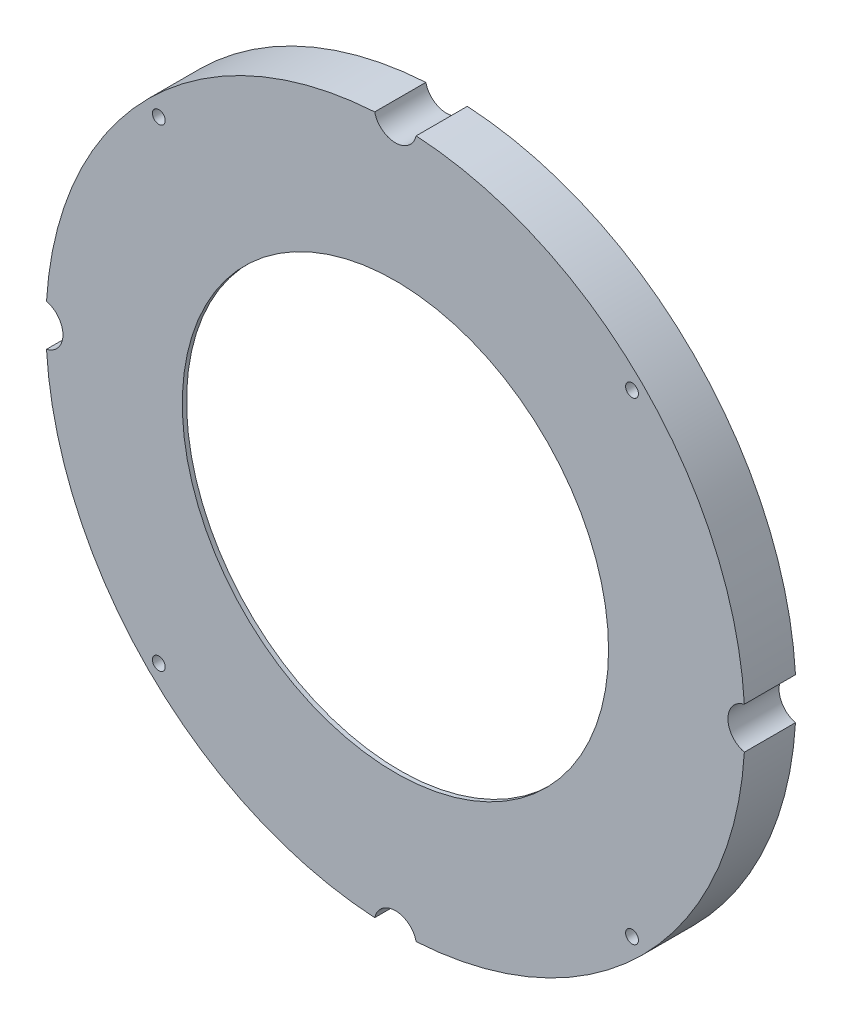
ISO-10303-21;
HEADER;
FILE_DESCRIPTION(('STEP AP214'),'2;1');
FILE_NAME('part.step','',(''),(''),'','','');
FILE_SCHEMA(('AUTOMOTIVE_DESIGN { 1 0 10303 214 1 1 1 1 }'));
ENDSEC;
DATA;
#1=APPLICATION_CONTEXT('core data for automotive mechanical design processes');
#2=APPLICATION_PROTOCOL_DEFINITION('international standard','automotive_design',2000,#1);
#3=PRODUCT_CONTEXT('',#1,'mechanical');
#4=PRODUCT('Part','Part','',(#3));
#5=PRODUCT_RELATED_PRODUCT_CATEGORY('part','',(#4));
#6=PRODUCT_DEFINITION_FORMATION('','',#4);
#7=PRODUCT_DEFINITION_CONTEXT('part definition',#1,'design');
#8=PRODUCT_DEFINITION('design','',#6,#7);
#9=PRODUCT_DEFINITION_SHAPE('','',#8);
#10=(LENGTH_UNIT() NAMED_UNIT(*) SI_UNIT(.MILLI.,.METRE.));
#11=(NAMED_UNIT(*) PLANE_ANGLE_UNIT() SI_UNIT($,.RADIAN.));
#12=(NAMED_UNIT(*) SI_UNIT($,.STERADIAN.) SOLID_ANGLE_UNIT());
#13=UNCERTAINTY_MEASURE_WITH_UNIT(LENGTH_MEASURE(1.E-05),#10,'distance_accuracy_value','');
#14=(GEOMETRIC_REPRESENTATION_CONTEXT(3) GLOBAL_UNCERTAINTY_ASSIGNED_CONTEXT((#13)) GLOBAL_UNIT_ASSIGNED_CONTEXT((#10,
#11,#12)) REPRESENTATION_CONTEXT('',''));
#15=CARTESIAN_POINT('',(0.,0.,0.));
#16=DIRECTION('',(0.,0.,1.));
#17=DIRECTION('',(1.,0.,0.));
#18=AXIS2_PLACEMENT_3D('',#15,#16,#17);
#19=CARTESIAN_POINT('',(0.,0.,1.));
#20=DIRECTION('',(0.,0.,-1.));
#21=DIRECTION('',(-1.,0.,0.));
#22=AXIS2_PLACEMENT_3D('',#19,#20,#21);
#23=CYLINDRICAL_SURFACE('',#22,82.);
#24=CARTESIAN_POINT('',(0.,0.,-11.));
#25=DIRECTION('',(0.,0.,-1.));
#26=DIRECTION('',(-1.,0.,0.));
#27=AXIS2_PLACEMENT_3D('',#24,#25,#26);
#28=CIRCLE('',#27,82.);
#29=CARTESIAN_POINT('',(-81.8554216867469,4.86723129559705,-11.));
#30=VERTEX_POINT('',#29);
#31=CARTESIAN_POINT('',(-4.86723129559619,81.855421686747,-11.));
#32=VERTEX_POINT('',#31);
#33=EDGE_CURVE('E117',#30,#32,#28,.T.);
#34=ORIENTED_EDGE('',*,*,#33,.F.);
#35=DIRECTION('',(0.,0.,1.));
#36=VECTOR('',#35,1.);
#37=CARTESIAN_POINT('',(-81.8554216867469,4.86723129559704,-5.));
#38=LINE('',#37,#36);
#39=CARTESIAN_POINT('',(-81.8554216867469,4.86723129559704,1.));
#40=VERTEX_POINT('',#39);
#41=EDGE_CURVE('E48',#30,#40,#38,.T.);
#42=ORIENTED_EDGE('',*,*,#41,.T.);
#43=CARTESIAN_POINT('',(0.,0.,1.));
#44=DIRECTION('',(0.,0.,1.));
#45=DIRECTION('',(1.,0.,0.));
#46=AXIS2_PLACEMENT_3D('',#43,#44,#45);
#47=CIRCLE('',#46,82.);
#48=CARTESIAN_POINT('',(-4.86723129559619,81.855421686747,1.));
#49=VERTEX_POINT('',#48);
#50=EDGE_CURVE('E11',#49,#40,#47,.T.);
#51=ORIENTED_EDGE('',*,*,#50,.F.);
#52=DIRECTION('',(0.,0.,1.));
#53=VECTOR('',#52,1.);
#54=CARTESIAN_POINT('',(-4.86723129559619,81.855421686747,-5.));
#55=LINE('',#54,#53);
#56=EDGE_CURVE('E156',#49,#32,#55,.F.);
#57=ORIENTED_EDGE('',*,*,#56,.T.);
#58=EDGE_LOOP('',(#34,#42,#51,#57));
#59=FACE_BOUND('',#58,.T.);
#60=ADVANCED_FACE('F32',(#59),#23,.T.);
#61=CARTESIAN_POINT('',(-81.8554216867471,-4.86723129559533,1.));
#62=VERTEX_POINT('',#61);
#63=CARTESIAN_POINT('',(-4.86723129559619,-81.855421686747,1.));
#64=VERTEX_POINT('',#63);
#65=EDGE_CURVE('E40',#62,#64,#47,.T.);
#66=ORIENTED_EDGE('',*,*,#65,.F.);
#67=DIRECTION('',(0.,0.,1.));
#68=VECTOR('',#67,1.);
#69=CARTESIAN_POINT('',(-81.8554216867471,-4.86723129559533,-5.));
#70=LINE('',#69,#68);
#71=CARTESIAN_POINT('',(-81.8554216867471,-4.86723129559533,-11.));
#72=VERTEX_POINT('',#71);
#73=EDGE_CURVE('E99',#62,#72,#70,.F.);
#74=ORIENTED_EDGE('',*,*,#73,.T.);
#75=CARTESIAN_POINT('',(-4.86723129559619,-81.855421686747,-11.));
#76=VERTEX_POINT('',#75);
#77=EDGE_CURVE('E110',#76,#72,#28,.T.);
#78=ORIENTED_EDGE('',*,*,#77,.F.);
#79=DIRECTION('',(0.,0.,1.));
#80=VECTOR('',#79,1.);
#81=CARTESIAN_POINT('',(-4.86723129559619,-81.855421686747,-5.));
#82=LINE('',#81,#80);
#83=EDGE_CURVE('E56',#76,#64,#82,.T.);
#84=ORIENTED_EDGE('',*,*,#83,.T.);
#85=EDGE_LOOP('',(#66,#74,#78,#84));
#86=FACE_BOUND('',#85,.T.);
#87=ADVANCED_FACE('F109',(#86),#23,.T.);
#88=CARTESIAN_POINT('',(4.86723129559619,-81.855421686747,1.));
#89=VERTEX_POINT('',#88);
#90=CARTESIAN_POINT('',(81.855421686747,-4.86723129559647,1.));
#91=VERTEX_POINT('',#90);
#92=EDGE_CURVE('E264',#89,#91,#47,.T.);
#93=ORIENTED_EDGE('',*,*,#92,.F.);
#94=DIRECTION('',(0.,0.,1.));
#95=VECTOR('',#94,1.);
#96=CARTESIAN_POINT('',(4.86723129559619,-81.855421686747,-5.));
#97=LINE('',#96,#95);
#98=CARTESIAN_POINT('',(4.86723129559619,-81.855421686747,-11.));
#99=VERTEX_POINT('',#98);
#100=EDGE_CURVE('E247',#89,#99,#97,.F.);
#101=ORIENTED_EDGE('',*,*,#100,.T.);
#102=CARTESIAN_POINT('',(81.855421686747,-4.86723129559648,-11.));
#103=VERTEX_POINT('',#102);
#104=EDGE_CURVE('E116',#103,#99,#28,.T.);
#105=ORIENTED_EDGE('',*,*,#104,.F.);
#106=DIRECTION('',(0.,0.,1.));
#107=VECTOR('',#106,1.);
#108=CARTESIAN_POINT('',(81.855421686747,-4.86723129559647,-5.));
#109=LINE('',#108,#107);
#110=EDGE_CURVE('E170',#103,#91,#109,.T.);
#111=ORIENTED_EDGE('',*,*,#110,.T.);
#112=EDGE_LOOP('',(#93,#101,#105,#111));
#113=FACE_BOUND('',#112,.T.);
#114=ADVANCED_FACE('F147',(#113),#23,.T.);
#115=CARTESIAN_POINT('',(0.,0.,1.));
#116=DIRECTION('',(0.,0.,1.));
#117=DIRECTION('',(1.,0.,0.));
#118=AXIS2_PLACEMENT_3D('',#115,#116,#117);
#119=PLANE('',#118);
#120=CARTESIAN_POINT('',(-55.5078823231446,-55.5078823231434,1.));
#121=DIRECTION('',(0.,0.,-1.));
#122=DIRECTION('',(0.,-1.,0.));
#123=AXIS2_PLACEMENT_3D('',#120,#121,#122);
#124=CIRCLE('',#123,1.5);
#125=CARTESIAN_POINT('',(-55.5078823231446,-57.0078823231434,1.));
#126=VERTEX_POINT('',#125);
#127=EDGE_CURVE('E218',#126,#126,#124,.T.);
#128=ORIENTED_EDGE('',*,*,#127,.T.);
#129=EDGE_LOOP('',(#128));
#130=FACE_BOUND('',#129,.T.);
#131=CARTESIAN_POINT('',(55.507882323144,-55.507882323144,1.));
#132=DIRECTION('',(0.,0.,-1.));
#133=DIRECTION('',(1.,0.,0.));
#134=AXIS2_PLACEMENT_3D('',#131,#132,#133);
#135=CIRCLE('',#134,1.5);
#136=CARTESIAN_POINT('',(57.007882323144,-55.507882323144,1.));
#137=VERTEX_POINT('',#136);
#138=EDGE_CURVE('E226',#137,#137,#135,.T.);
#139=ORIENTED_EDGE('',*,*,#138,.T.);
#140=EDGE_LOOP('',(#139));
#141=FACE_BOUND('',#140,.T.);
#142=CARTESIAN_POINT('',(55.5078823231442,55.5078823231438,1.));
#143=DIRECTION('',(0.,0.,-1.));
#144=DIRECTION('',(0.,1.,0.));
#145=AXIS2_PLACEMENT_3D('',#142,#143,#144);
#146=CIRCLE('',#145,1.5);
#147=CARTESIAN_POINT('',(55.5078823231442,57.0078823231438,1.));
#148=VERTEX_POINT('',#147);
#149=EDGE_CURVE('E232',#148,#148,#146,.T.);
#150=ORIENTED_EDGE('',*,*,#149,.T.);
#151=EDGE_LOOP('',(#150));
#152=FACE_BOUND('',#151,.T.);
#153=CARTESIAN_POINT('',(-55.507882323144,55.507882323144,1.));
#154=DIRECTION('',(0.,0.,-1.));
#155=DIRECTION('',(-1.,0.,0.));
#156=AXIS2_PLACEMENT_3D('',#153,#154,#155);
#157=CIRCLE('',#156,1.5);
#158=CARTESIAN_POINT('',(-57.007882323144,55.507882323144,1.));
#159=VERTEX_POINT('',#158);
#160=EDGE_CURVE('E238',#159,#159,#157,.T.);
#161=ORIENTED_EDGE('',*,*,#160,.T.);
#162=EDGE_LOOP('',(#161));
#163=FACE_BOUND('',#162,.T.);
#164=CARTESIAN_POINT('',(-83.,8.6937885337194E-13,1.));
#165=DIRECTION('',(0.,0.,1.));
#166=DIRECTION('',(0.,1.,0.));
#167=AXIS2_PLACEMENT_3D('',#164,#165,#166);
#168=CIRCLE('',#167,5.);
#169=EDGE_CURVE('E104',#62,#40,#168,.T.);
#170=ORIENTED_EDGE('',*,*,#169,.F.);
#171=ORIENTED_EDGE('',*,*,#65,.T.);
#172=CARTESIAN_POINT('',(0.,-83.,1.));
#173=DIRECTION('',(0.,0.,1.));
#174=DIRECTION('',(-1.,0.,0.));
#175=AXIS2_PLACEMENT_3D('',#172,#173,#174);
#176=CIRCLE('',#175,5.);
#177=EDGE_CURVE('E245',#89,#64,#176,.T.);
#178=ORIENTED_EDGE('',*,*,#177,.F.);
#179=ORIENTED_EDGE('',*,*,#92,.T.);
#180=CARTESIAN_POINT('',(83.,-2.8979295112398E-13,1.));
#181=DIRECTION('',(0.,0.,1.));
#182=DIRECTION('',(0.,-1.,0.));
#183=AXIS2_PLACEMENT_3D('',#180,#181,#182);
#184=CIRCLE('',#183,5.);
#185=CARTESIAN_POINT('',(81.855421686747,4.8672312955959,1.));
#186=VERTEX_POINT('',#185);
#187=EDGE_CURVE('E252',#186,#91,#184,.T.);
#188=ORIENTED_EDGE('',*,*,#187,.F.);
#189=CARTESIAN_POINT('',(4.86723129559619,81.855421686747,1.));
#190=VERTEX_POINT('',#189);
#191=EDGE_CURVE('E41',#186,#190,#47,.T.);
#192=ORIENTED_EDGE('',*,*,#191,.T.);
#193=CARTESIAN_POINT('',(0.,83.,1.));
#194=DIRECTION('',(0.,0.,1.));
#195=DIRECTION('',(1.,0.,0.));
#196=AXIS2_PLACEMENT_3D('',#193,#194,#195);
#197=CIRCLE('',#196,5.);
#198=EDGE_CURVE('E167',#49,#190,#197,.T.);
#199=ORIENTED_EDGE('',*,*,#198,.F.);
#200=ORIENTED_EDGE('',*,*,#50,.T.);
#201=EDGE_LOOP('',(#170,#171,#178,#179,#188,#192,#199,#200));
#202=FACE_BOUND('',#201,.T.);
#203=CARTESIAN_POINT('',(0.,0.,1.));
#204=DIRECTION('',(0.,0.,1.));
#205=DIRECTION('',(1.,0.,0.));
#206=AXIS2_PLACEMENT_3D('',#203,#204,#205);
#207=CIRCLE('',#206,50.);
#208=CARTESIAN_POINT('',(50.,0.,1.));
#209=VERTEX_POINT('',#208);
#210=EDGE_CURVE('E127',#209,#209,#207,.T.);
#211=ORIENTED_EDGE('',*,*,#210,.F.);
#212=EDGE_LOOP('',(#211));
#213=FACE_BOUND('',#212,.T.);
#214=ADVANCED_FACE('F268',(#130,#141,#152,#163,#202,#213),#119,.T.);
#215=CARTESIAN_POINT('',(0.,0.,0.));
#216=DIRECTION('',(0.,0.,1.));
#217=DIRECTION('',(1.,0.,0.));
#218=AXIS2_PLACEMENT_3D('',#215,#216,#217);
#219=PLANE('',#218);
#220=CARTESIAN_POINT('',(0.,0.,0.));
#221=DIRECTION('',(0.,0.,-1.));
#222=DIRECTION('',(-1.,0.,0.));
#223=AXIS2_PLACEMENT_3D('',#220,#221,#222);
#224=CIRCLE('',#223,75.);
#225=CARTESIAN_POINT('',(-75.,0.,0.));
#226=VERTEX_POINT('',#225);
#227=EDGE_CURVE('E125',#226,#226,#224,.T.);
#228=ORIENTED_EDGE('',*,*,#227,.T.);
#229=EDGE_LOOP('',(#228));
#230=FACE_BOUND('',#229,.T.);
#231=CARTESIAN_POINT('',(0.,0.,0.));
#232=DIRECTION('',(0.,0.,1.));
#233=DIRECTION('',(1.,0.,0.));
#234=AXIS2_PLACEMENT_3D('',#231,#232,#233);
#235=CIRCLE('',#234,50.);
#236=CARTESIAN_POINT('',(50.,0.,0.));
#237=VERTEX_POINT('',#236);
#238=EDGE_CURVE('E124',#237,#237,#235,.T.);
#239=ORIENTED_EDGE('',*,*,#238,.T.);
#240=EDGE_LOOP('',(#239));
#241=FACE_BOUND('',#240,.T.);
#242=ADVANCED_FACE('F132',(#230,#241),#219,.F.);
#243=ORIENTED_EDGE('',*,*,#191,.F.);
#244=DIRECTION('',(0.,0.,1.));
#245=VECTOR('',#244,1.);
#246=CARTESIAN_POINT('',(81.855421686747,4.8672312955959,-5.));
#247=LINE('',#246,#245);
#248=CARTESIAN_POINT('',(81.855421686747,4.8672312955959,-11.));
#249=VERTEX_POINT('',#248);
#250=EDGE_CURVE('E256',#186,#249,#247,.F.);
#251=ORIENTED_EDGE('',*,*,#250,.T.);
#252=CARTESIAN_POINT('',(4.86723129559619,81.855421686747,-11.));
#253=VERTEX_POINT('',#252);
#254=EDGE_CURVE('E119',#253,#249,#28,.T.);
#255=ORIENTED_EDGE('',*,*,#254,.F.);
#256=DIRECTION('',(0.,0.,1.));
#257=VECTOR('',#256,1.);
#258=CARTESIAN_POINT('',(4.86723129559619,81.855421686747,-5.));
#259=LINE('',#258,#257);
#260=EDGE_CURVE('E166',#253,#190,#259,.T.);
#261=ORIENTED_EDGE('',*,*,#260,.T.);
#262=EDGE_LOOP('',(#243,#251,#255,#261));
#263=FACE_BOUND('',#262,.T.);
#264=ADVANCED_FACE('F34',(#263),#23,.T.);
#265=CARTESIAN_POINT('',(0.,0.,1.));
#266=DIRECTION('',(0.,0.,-1.));
#267=DIRECTION('',(-1.,0.,0.));
#268=AXIS2_PLACEMENT_3D('',#265,#266,#267);
#269=CYLINDRICAL_SURFACE('',#268,50.);
#270=ORIENTED_EDGE('',*,*,#210,.T.);
#271=EDGE_LOOP('',(#270));
#272=FACE_BOUND('',#271,.T.);
#273=ORIENTED_EDGE('',*,*,#238,.F.);
#274=EDGE_LOOP('',(#273));
#275=FACE_BOUND('',#274,.T.);
#276=ADVANCED_FACE('F134',(#272,#275),#269,.F.);
#277=CARTESIAN_POINT('',(0.,0.,-11.));
#278=DIRECTION('',(0.,0.,-1.));
#279=DIRECTION('',(-1.,0.,0.));
#280=AXIS2_PLACEMENT_3D('',#277,#278,#279);
#281=PLANE('',#280);
#282=CARTESIAN_POINT('',(-55.5078823231446,-55.5078823231434,-11.));
#283=DIRECTION('',(0.,0.,-1.));
#284=DIRECTION('',(0.,-1.,0.));
#285=AXIS2_PLACEMENT_3D('',#282,#283,#284);
#286=CIRCLE('',#285,1.5);
#287=CARTESIAN_POINT('',(-55.5078823231446,-57.0078823231434,-11.));
#288=VERTEX_POINT('',#287);
#289=EDGE_CURVE('E221',#288,#288,#286,.T.);
#290=ORIENTED_EDGE('',*,*,#289,.F.);
#291=EDGE_LOOP('',(#290));
#292=FACE_BOUND('',#291,.T.);
#293=CARTESIAN_POINT('',(55.507882323144,-55.507882323144,-11.));
#294=DIRECTION('',(0.,0.,-1.));
#295=DIRECTION('',(1.,0.,0.));
#296=AXIS2_PLACEMENT_3D('',#293,#294,#295);
#297=CIRCLE('',#296,1.5);
#298=CARTESIAN_POINT('',(57.007882323144,-55.507882323144,-11.));
#299=VERTEX_POINT('',#298);
#300=EDGE_CURVE('E223',#299,#299,#297,.T.);
#301=ORIENTED_EDGE('',*,*,#300,.F.);
#302=EDGE_LOOP('',(#301));
#303=FACE_BOUND('',#302,.T.);
#304=CARTESIAN_POINT('',(55.5078823231442,55.5078823231438,-11.));
#305=DIRECTION('',(0.,0.,-1.));
#306=DIRECTION('',(0.,1.,0.));
#307=AXIS2_PLACEMENT_3D('',#304,#305,#306);
#308=CIRCLE('',#307,1.5);
#309=CARTESIAN_POINT('',(55.5078823231442,57.0078823231438,-11.));
#310=VERTEX_POINT('',#309);
#311=EDGE_CURVE('E229',#310,#310,#308,.T.);
#312=ORIENTED_EDGE('',*,*,#311,.F.);
#313=EDGE_LOOP('',(#312));
#314=FACE_BOUND('',#313,.T.);
#315=CARTESIAN_POINT('',(-55.507882323144,55.507882323144,-11.));
#316=DIRECTION('',(0.,0.,-1.));
#317=DIRECTION('',(-1.,0.,0.));
#318=AXIS2_PLACEMENT_3D('',#315,#316,#317);
#319=CIRCLE('',#318,1.5);
#320=CARTESIAN_POINT('',(-57.007882323144,55.507882323144,-11.));
#321=VERTEX_POINT('',#320);
#322=EDGE_CURVE('E235',#321,#321,#319,.T.);
#323=ORIENTED_EDGE('',*,*,#322,.F.);
#324=EDGE_LOOP('',(#323));
#325=FACE_BOUND('',#324,.T.);
#326=CARTESIAN_POINT('',(-83.,8.6937885337194E-13,-11.));
#327=DIRECTION('',(0.,0.,1.));
#328=DIRECTION('',(0.,1.,0.));
#329=AXIS2_PLACEMENT_3D('',#326,#327,#328);
#330=CIRCLE('',#329,5.);
#331=EDGE_CURVE('E96',#72,#30,#330,.T.);
#332=ORIENTED_EDGE('',*,*,#331,.T.);
#333=ORIENTED_EDGE('',*,*,#33,.T.);
#334=CARTESIAN_POINT('',(0.,83.,-11.));
#335=DIRECTION('',(0.,0.,1.));
#336=DIRECTION('',(1.,0.,0.));
#337=AXIS2_PLACEMENT_3D('',#334,#335,#336);
#338=CIRCLE('',#337,5.);
#339=EDGE_CURVE('E159',#32,#253,#338,.T.);
#340=ORIENTED_EDGE('',*,*,#339,.T.);
#341=ORIENTED_EDGE('',*,*,#254,.T.);
#342=CARTESIAN_POINT('',(83.,-2.8979295112398E-13,-11.));
#343=DIRECTION('',(0.,0.,1.));
#344=DIRECTION('',(0.,-1.,0.));
#345=AXIS2_PLACEMENT_3D('',#342,#343,#344);
#346=CIRCLE('',#345,5.);
#347=EDGE_CURVE('E253',#249,#103,#346,.T.);
#348=ORIENTED_EDGE('',*,*,#347,.T.);
#349=ORIENTED_EDGE('',*,*,#104,.T.);
#350=CARTESIAN_POINT('',(0.,-83.,-11.));
#351=DIRECTION('',(0.,0.,1.));
#352=DIRECTION('',(-1.,0.,0.));
#353=AXIS2_PLACEMENT_3D('',#350,#351,#352);
#354=CIRCLE('',#353,5.);
#355=EDGE_CURVE('E115',#99,#76,#354,.T.);
#356=ORIENTED_EDGE('',*,*,#355,.T.);
#357=ORIENTED_EDGE('',*,*,#77,.T.);
#358=EDGE_LOOP('',(#332,#333,#340,#341,#348,#349,#356,#357));
#359=FACE_BOUND('',#358,.T.);
#360=CARTESIAN_POINT('',(0.,0.,-11.));
#361=DIRECTION('',(0.,0.,-1.));
#362=DIRECTION('',(-1.,0.,0.));
#363=AXIS2_PLACEMENT_3D('',#360,#361,#362);
#364=CIRCLE('',#363,75.);
#365=CARTESIAN_POINT('',(-75.,0.,-11.));
#366=VERTEX_POINT('',#365);
#367=EDGE_CURVE('E120',#366,#366,#364,.T.);
#368=ORIENTED_EDGE('',*,*,#367,.F.);
#369=EDGE_LOOP('',(#368));
#370=FACE_BOUND('',#369,.T.);
#371=ADVANCED_FACE('F112',(#292,#303,#314,#325,#359,#370),#281,.T.);
#372=CARTESIAN_POINT('',(0.,0.,-11.));
#373=DIRECTION('',(0.,0.,1.));
#374=DIRECTION('',(1.,0.,0.));
#375=AXIS2_PLACEMENT_3D('',#372,#373,#374);
#376=CYLINDRICAL_SURFACE('',#375,75.);
#377=ORIENTED_EDGE('',*,*,#367,.T.);
#378=EDGE_LOOP('',(#377));
#379=FACE_BOUND('',#378,.T.);
#380=ORIENTED_EDGE('',*,*,#227,.F.);
#381=EDGE_LOOP('',(#380));
#382=FACE_BOUND('',#381,.T.);
#383=ADVANCED_FACE('F143',(#379,#382),#376,.F.);
#384=CARTESIAN_POINT('',(0.,83.,-11.));
#385=DIRECTION('',(0.,0.,1.));
#386=DIRECTION('',(1.,0.,0.));
#387=AXIS2_PLACEMENT_3D('',#384,#385,#386);
#388=CYLINDRICAL_SURFACE('',#387,5.);
#389=ORIENTED_EDGE('',*,*,#339,.F.);
#390=ORIENTED_EDGE('',*,*,#56,.F.);
#391=ORIENTED_EDGE('',*,*,#198,.T.);
#392=ORIENTED_EDGE('',*,*,#260,.F.);
#393=EDGE_LOOP('',(#389,#390,#391,#392));
#394=FACE_BOUND('',#393,.T.);
#395=ADVANCED_FACE('F162',(#394),#388,.F.);
#396=CARTESIAN_POINT('',(83.,-2.8979295112398E-13,-11.));
#397=DIRECTION('',(0.,0.,1.));
#398=DIRECTION('',(1.,0.,0.));
#399=AXIS2_PLACEMENT_3D('',#396,#397,#398);
#400=CYLINDRICAL_SURFACE('',#399,5.);
#401=ORIENTED_EDGE('',*,*,#347,.F.);
#402=ORIENTED_EDGE('',*,*,#250,.F.);
#403=ORIENTED_EDGE('',*,*,#187,.T.);
#404=ORIENTED_EDGE('',*,*,#110,.F.);
#405=EDGE_LOOP('',(#401,#402,#403,#404));
#406=FACE_BOUND('',#405,.T.);
#407=ADVANCED_FACE('F187',(#406),#400,.F.);
#408=CARTESIAN_POINT('',(0.,-83.,-11.));
#409=DIRECTION('',(0.,0.,1.));
#410=DIRECTION('',(1.,0.,0.));
#411=AXIS2_PLACEMENT_3D('',#408,#409,#410);
#412=CYLINDRICAL_SURFACE('',#411,5.);
#413=ORIENTED_EDGE('',*,*,#355,.F.);
#414=ORIENTED_EDGE('',*,*,#100,.F.);
#415=ORIENTED_EDGE('',*,*,#177,.T.);
#416=ORIENTED_EDGE('',*,*,#83,.F.);
#417=EDGE_LOOP('',(#413,#414,#415,#416));
#418=FACE_BOUND('',#417,.T.);
#419=ADVANCED_FACE('F192',(#418),#412,.F.);
#420=CARTESIAN_POINT('',(-83.,8.6937885337194E-13,-11.));
#421=DIRECTION('',(0.,0.,1.));
#422=DIRECTION('',(1.,0.,0.));
#423=AXIS2_PLACEMENT_3D('',#420,#421,#422);
#424=CYLINDRICAL_SURFACE('',#423,5.);
#425=ORIENTED_EDGE('',*,*,#331,.F.);
#426=ORIENTED_EDGE('',*,*,#73,.F.);
#427=ORIENTED_EDGE('',*,*,#169,.T.);
#428=ORIENTED_EDGE('',*,*,#41,.F.);
#429=EDGE_LOOP('',(#425,#426,#427,#428));
#430=FACE_BOUND('',#429,.T.);
#431=ADVANCED_FACE('F98',(#430),#424,.F.);
#432=CARTESIAN_POINT('',(-55.507882323144,55.507882323144,1.));
#433=DIRECTION('',(0.,0.,-1.));
#434=DIRECTION('',(-1.,0.,0.));
#435=AXIS2_PLACEMENT_3D('',#432,#433,#434);
#436=CYLINDRICAL_SURFACE('',#435,1.5);
#437=ORIENTED_EDGE('',*,*,#160,.F.);
#438=EDGE_LOOP('',(#437));
#439=FACE_BOUND('',#438,.T.);
#440=ORIENTED_EDGE('',*,*,#322,.T.);
#441=EDGE_LOOP('',(#440));
#442=FACE_BOUND('',#441,.T.);
#443=ADVANCED_FACE('F198',(#439,#442),#436,.F.);
#444=CARTESIAN_POINT('',(55.5078823231442,55.5078823231438,1.));
#445=DIRECTION('',(0.,0.,-1.));
#446=DIRECTION('',(-1.,0.,0.));
#447=AXIS2_PLACEMENT_3D('',#444,#445,#446);
#448=CYLINDRICAL_SURFACE('',#447,1.5);
#449=ORIENTED_EDGE('',*,*,#149,.F.);
#450=EDGE_LOOP('',(#449));
#451=FACE_BOUND('',#450,.T.);
#452=ORIENTED_EDGE('',*,*,#311,.T.);
#453=EDGE_LOOP('',(#452));
#454=FACE_BOUND('',#453,.T.);
#455=ADVANCED_FACE('F201',(#451,#454),#448,.F.);
#456=CARTESIAN_POINT('',(55.507882323144,-55.507882323144,1.));
#457=DIRECTION('',(0.,0.,-1.));
#458=DIRECTION('',(-1.,0.,0.));
#459=AXIS2_PLACEMENT_3D('',#456,#457,#458);
#460=CYLINDRICAL_SURFACE('',#459,1.5);
#461=ORIENTED_EDGE('',*,*,#138,.F.);
#462=EDGE_LOOP('',(#461));
#463=FACE_BOUND('',#462,.T.);
#464=ORIENTED_EDGE('',*,*,#300,.T.);
#465=EDGE_LOOP('',(#464));
#466=FACE_BOUND('',#465,.T.);
#467=ADVANCED_FACE('F205',(#463,#466),#460,.F.);
#468=CARTESIAN_POINT('',(-55.5078823231446,-55.5078823231434,1.));
#469=DIRECTION('',(0.,0.,-1.));
#470=DIRECTION('',(-1.,0.,0.));
#471=AXIS2_PLACEMENT_3D('',#468,#469,#470);
#472=CYLINDRICAL_SURFACE('',#471,1.5);
#473=ORIENTED_EDGE('',*,*,#127,.F.);
#474=EDGE_LOOP('',(#473));
#475=FACE_BOUND('',#474,.T.);
#476=ORIENTED_EDGE('',*,*,#289,.T.);
#477=EDGE_LOOP('',(#476));
#478=FACE_BOUND('',#477,.T.);
#479=ADVANCED_FACE('F209',(#475,#478),#472,.F.);
#480=CLOSED_SHELL('',(#60,#87,#114,#214,#242,#264,#276,#371,#383,#395,#407,#419,#431,#443,#455,
#467,#479));
#481=MANIFOLD_SOLID_BREP('B2',#480);
#482=ADVANCED_BREP_SHAPE_REPRESENTATION('',(#18,#481),#14);
#483=SHAPE_DEFINITION_REPRESENTATION(#9,#482);
ENDSEC;
END-ISO-10303-21;
